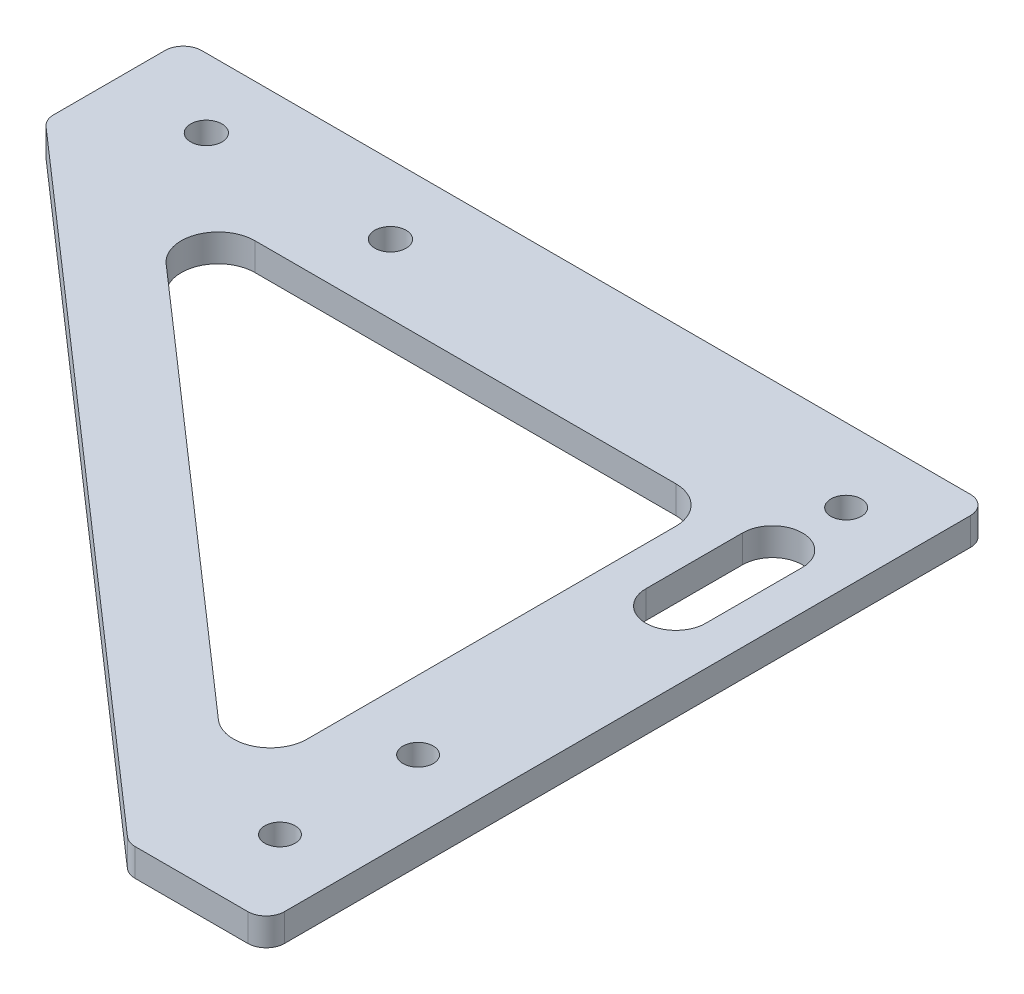
ISO-10303-21;
HEADER;
FILE_DESCRIPTION(('STEP AP214'),'2;1');
FILE_NAME('part.step','',(''),(''),'','','');
FILE_SCHEMA(('AUTOMOTIVE_DESIGN { 1 0 10303 214 1 1 1 1 }'));
ENDSEC;
DATA;
#1=APPLICATION_CONTEXT('core data for automotive mechanical design processes');
#2=APPLICATION_PROTOCOL_DEFINITION('international standard','automotive_design',2000,#1);
#3=PRODUCT_CONTEXT('',#1,'mechanical');
#4=PRODUCT('Part','Part','',(#3));
#5=PRODUCT_RELATED_PRODUCT_CATEGORY('part','',(#4));
#6=PRODUCT_DEFINITION_FORMATION('','',#4);
#7=PRODUCT_DEFINITION_CONTEXT('part definition',#1,'design');
#8=PRODUCT_DEFINITION('design','',#6,#7);
#9=PRODUCT_DEFINITION_SHAPE('','',#8);
#10=(LENGTH_UNIT() NAMED_UNIT(*) SI_UNIT(.MILLI.,.METRE.));
#11=(NAMED_UNIT(*) PLANE_ANGLE_UNIT() SI_UNIT($,.RADIAN.));
#12=(NAMED_UNIT(*) SI_UNIT($,.STERADIAN.) SOLID_ANGLE_UNIT());
#13=UNCERTAINTY_MEASURE_WITH_UNIT(LENGTH_MEASURE(1.E-05),#10,'distance_accuracy_value','');
#14=(GEOMETRIC_REPRESENTATION_CONTEXT(3) GLOBAL_UNCERTAINTY_ASSIGNED_CONTEXT((#13)) GLOBAL_UNIT_ASSIGNED_CONTEXT((#10,
#11,#12)) REPRESENTATION_CONTEXT('',''));
#15=CARTESIAN_POINT('',(0.,0.,0.));
#16=DIRECTION('',(0.,0.,1.));
#17=DIRECTION('',(1.,0.,0.));
#18=AXIS2_PLACEMENT_3D('',#15,#16,#17);
#19=CARTESIAN_POINT('',(0.,3.,0.));
#20=DIRECTION('',(0.,1.,0.));
#21=DIRECTION('',(0.,0.,1.));
#22=AXIS2_PLACEMENT_3D('',#19,#20,#21);
#23=PLANE('',#22);
#24=CARTESIAN_POINT('',(-70.,3.,-19.));
#25=DIRECTION('',(0.,1.,0.));
#26=DIRECTION('',(0.,0.,1.));
#27=AXIS2_PLACEMENT_3D('',#24,#25,#26);
#28=CIRCLE('',#27,1.7);
#29=CARTESIAN_POINT('',(-70.,3.,-17.3));
#30=VERTEX_POINT('',#29);
#31=EDGE_CURVE('E222',#30,#30,#28,.T.);
#32=ORIENTED_EDGE('',*,*,#31,.F.);
#33=EDGE_LOOP('',(#32));
#34=FACE_BOUND('',#33,.T.);
#35=CARTESIAN_POINT('',(0.,3.,28.));
#36=DIRECTION('',(0.,1.,0.));
#37=DIRECTION('',(0.,0.,1.));
#38=AXIS2_PLACEMENT_3D('',#35,#36,#37);
#39=CIRCLE('',#38,1.65);
#40=CARTESIAN_POINT('',(0.,3.,29.65));
#41=VERTEX_POINT('',#40);
#42=EDGE_CURVE('E246',#41,#41,#39,.T.);
#43=ORIENTED_EDGE('',*,*,#42,.F.);
#44=EDGE_LOOP('',(#43));
#45=FACE_BOUND('',#44,.T.);
#46=DIRECTION('',(0.,0.,-1.));
#47=VECTOR('',#46,1.);
#48=CARTESIAN_POINT('',(3.25,3.,0.));
#49=LINE('',#48,#47);
#50=CARTESIAN_POINT('',(3.25,3.,0.));
#51=VERTEX_POINT('',#50);
#52=CARTESIAN_POINT('',(3.25,3.,-10.5));
#53=VERTEX_POINT('',#52);
#54=EDGE_CURVE('E265',#51,#53,#49,.T.);
#55=ORIENTED_EDGE('',*,*,#54,.F.);
#56=CARTESIAN_POINT('',(0.,3.,0.));
#57=DIRECTION('',(0.,1.,0.));
#58=DIRECTION('',(0.,0.,1.));
#59=AXIS2_PLACEMENT_3D('',#56,#57,#58);
#60=CIRCLE('',#59,3.25);
#61=CARTESIAN_POINT('',(-3.25,3.,0.));
#62=VERTEX_POINT('',#61);
#63=EDGE_CURVE('E257',#62,#51,#60,.T.);
#64=ORIENTED_EDGE('',*,*,#63,.F.);
#65=DIRECTION('',(0.,0.,1.));
#66=VECTOR('',#65,1.);
#67=CARTESIAN_POINT('',(-3.25,3.,0.));
#68=LINE('',#67,#66);
#69=CARTESIAN_POINT('',(-3.25,3.,-10.5));
#70=VERTEX_POINT('',#69);
#71=EDGE_CURVE('E268',#70,#62,#68,.T.);
#72=ORIENTED_EDGE('',*,*,#71,.F.);
#73=CARTESIAN_POINT('',(0.,3.,-10.5));
#74=DIRECTION('',(0.,1.,0.));
#75=DIRECTION('',(0.,0.,1.));
#76=AXIS2_PLACEMENT_3D('',#73,#74,#75);
#77=CIRCLE('',#76,3.25);
#78=EDGE_CURVE('E264',#53,#70,#77,.T.);
#79=ORIENTED_EDGE('',*,*,#78,.F.);
#80=EDGE_LOOP('',(#55,#64,#72,#79));
#81=FACE_BOUND('',#80,.T.);
#82=DIRECTION('',(-1.,0.,0.));
#83=VECTOR('',#82,1.);
#84=CARTESIAN_POINT('',(7.50000000000001,3.,-26.5));
#85=LINE('',#84,#83);
#86=CARTESIAN_POINT('',(5.50000000000001,3.,-26.5));
#87=VERTEX_POINT('',#86);
#88=CARTESIAN_POINT('',(-78.,3.,-26.5));
#89=VERTEX_POINT('',#88);
#90=EDGE_CURVE('E294',#87,#89,#85,.T.);
#91=ORIENTED_EDGE('',*,*,#90,.T.);
#92=CARTESIAN_POINT('',(-78.,3.,-24.5));
#93=DIRECTION('',(0.,1.,0.));
#94=DIRECTION('',(0.,0.,1.));
#95=AXIS2_PLACEMENT_3D('',#92,#93,#94);
#96=CIRCLE('',#95,2.);
#97=CARTESIAN_POINT('',(-80.,3.,-24.5));
#98=VERTEX_POINT('',#97);
#99=EDGE_CURVE('E342',#89,#98,#96,.T.);
#100=ORIENTED_EDGE('',*,*,#99,.T.);
#101=DIRECTION('',(0.,0.,1.));
#102=VECTOR('',#101,1.);
#103=CARTESIAN_POINT('',(-80.,3.,-26.5));
#104=LINE('',#103,#102);
#105=CARTESIAN_POINT('',(-80.,3.,-12.4069479846539));
#106=VERTEX_POINT('',#105);
#107=EDGE_CURVE('E297',#98,#106,#104,.T.);
#108=ORIENTED_EDGE('',*,*,#107,.T.);
#109=CARTESIAN_POINT('',(-78.,3.,-12.4069479846539));
#110=DIRECTION('',(0.,1.,0.));
#111=DIRECTION('',(0.,0.,1.));
#112=AXIS2_PLACEMENT_3D('',#109,#110,#111);
#113=CIRCLE('',#112,2.);
#114=CARTESIAN_POINT('',(-79.3177436383001,3.,-10.9024375314766));
#115=VERTEX_POINT('',#114);
#116=EDGE_CURVE('E345',#106,#115,#113,.T.);
#117=ORIENTED_EDGE('',*,*,#116,.T.);
#118=DIRECTION('',(0.752255226588632,0.,0.658871819150043));
#119=VECTOR('',#118,1.);
#120=CARTESIAN_POINT('',(-80.,3.,-11.5));
#121=LINE('',#120,#119);
#122=CARTESIAN_POINT('',(-8.06571641172672,3.,51.5045104531773));
#123=VERTEX_POINT('',#122);
#124=EDGE_CURVE('E303',#115,#123,#121,.T.);
#125=ORIENTED_EDGE('',*,*,#124,.T.);
#126=CARTESIAN_POINT('',(-6.74797277342664,3.,50.));
#127=DIRECTION('',(0.,1.,0.));
#128=DIRECTION('',(0.,0.,1.));
#129=AXIS2_PLACEMENT_3D('',#126,#127,#128);
#130=CIRCLE('',#129,2.);
#131=CARTESIAN_POINT('',(-6.74797277342664,3.,52.));
#132=VERTEX_POINT('',#131);
#133=EDGE_CURVE('E64',#123,#132,#130,.T.);
#134=ORIENTED_EDGE('',*,*,#133,.T.);
#135=DIRECTION('',(1.,0.,0.));
#136=VECTOR('',#135,1.);
#137=CARTESIAN_POINT('',(7.50000000000001,3.,52.));
#138=LINE('',#137,#136);
#139=CARTESIAN_POINT('',(5.50000000000001,3.,52.));
#140=VERTEX_POINT('',#139);
#141=EDGE_CURVE('E301',#132,#140,#138,.T.);
#142=ORIENTED_EDGE('',*,*,#141,.T.);
#143=CARTESIAN_POINT('',(5.50000000000001,3.,50.));
#144=DIRECTION('',(0.,1.,0.));
#145=DIRECTION('',(0.,0.,1.));
#146=AXIS2_PLACEMENT_3D('',#143,#144,#145);
#147=CIRCLE('',#146,2.);
#148=CARTESIAN_POINT('',(7.50000000000001,3.,50.));
#149=VERTEX_POINT('',#148);
#150=EDGE_CURVE('E338',#140,#149,#147,.T.);
#151=ORIENTED_EDGE('',*,*,#150,.T.);
#152=DIRECTION('',(0.,0.,-1.));
#153=VECTOR('',#152,1.);
#154=CARTESIAN_POINT('',(7.50000000000001,3.,52.));
#155=LINE('',#154,#153);
#156=CARTESIAN_POINT('',(7.50000000000001,3.,-24.5));
#157=VERTEX_POINT('',#156);
#158=EDGE_CURVE('E292',#149,#157,#155,.T.);
#159=ORIENTED_EDGE('',*,*,#158,.T.);
#160=CARTESIAN_POINT('',(5.50000000000001,3.,-24.5));
#161=DIRECTION('',(0.,1.,0.));
#162=DIRECTION('',(0.,0.,1.));
#163=AXIS2_PLACEMENT_3D('',#160,#161,#162);
#164=CIRCLE('',#163,2.);
#165=EDGE_CURVE('E340',#157,#87,#164,.T.);
#166=ORIENTED_EDGE('',*,*,#165,.T.);
#167=EDGE_LOOP('',(#91,#100,#108,#117,#125,#134,#142,#151,#159,#166));
#168=FACE_BOUND('',#167,.T.);
#169=CARTESIAN_POINT('',(0.,3.,-18.5));
#170=DIRECTION('',(0.,1.,0.));
#171=DIRECTION('',(0.,0.,1.));
#172=AXIS2_PLACEMENT_3D('',#169,#170,#171);
#173=CIRCLE('',#172,1.65);
#174=CARTESIAN_POINT('',(0.,3.,-16.85));
#175=VERTEX_POINT('',#174);
#176=EDGE_CURVE('E255',#175,#175,#173,.T.);
#177=ORIENTED_EDGE('',*,*,#176,.F.);
#178=EDGE_LOOP('',(#177));
#179=FACE_BOUND('',#178,.T.);
#180=CARTESIAN_POINT('',(0.,3.,43.));
#181=DIRECTION('',(0.,1.,0.));
#182=DIRECTION('',(0.,0.,1.));
#183=AXIS2_PLACEMENT_3D('',#180,#181,#182);
#184=CIRCLE('',#183,1.65);
#185=CARTESIAN_POINT('',(0.,3.,44.65));
#186=VERTEX_POINT('',#185);
#187=EDGE_CURVE('E245',#186,#186,#184,.T.);
#188=ORIENTED_EDGE('',*,*,#187,.F.);
#189=EDGE_LOOP('',(#188));
#190=FACE_BOUND('',#189,.T.);
#191=DIRECTION('',(0.,0.,-1.));
#192=VECTOR('',#191,1.);
#193=CARTESIAN_POINT('',(-7.49999999999999,3.,32.5445189886284));
#194=LINE('',#193,#192);
#195=CARTESIAN_POINT('',(-7.49999999999999,3.,32.5445189886284));
#196=VERTEX_POINT('',#195);
#197=CARTESIAN_POINT('',(-7.49999999999999,3.,-7.5));
#198=VERTEX_POINT('',#197);
#199=EDGE_CURVE('E191',#196,#198,#194,.T.);
#200=ORIENTED_EDGE('',*,*,#199,.F.);
#201=CARTESIAN_POINT('',(-11.5,3.,32.5445189886284));
#202=DIRECTION('',(0.,1.,0.));
#203=DIRECTION('',(0.,0.,1.));
#204=AXIS2_PLACEMENT_3D('',#201,#202,#203);
#205=CIRCLE('',#204,4.);
#206=CARTESIAN_POINT('',(-14.1354872766002,3.,35.5535398949829));
#207=VERTEX_POINT('',#206);
#208=EDGE_CURVE('E181',#207,#196,#205,.T.);
#209=ORIENTED_EDGE('',*,*,#208,.F.);
#210=DIRECTION('',(0.752255226588632,0.,0.658871819150043));
#211=VECTOR('',#210,1.);
#212=CARTESIAN_POINT('',(-59.8556073817271,3.,-4.49097909364547));
#213=LINE('',#212,#211);
#214=CARTESIAN_POINT('',(-59.8556073817271,3.,-4.49097909364547));
#215=VERTEX_POINT('',#214);
#216=EDGE_CURVE('E220',#215,#207,#213,.T.);
#217=ORIENTED_EDGE('',*,*,#216,.F.);
#218=CARTESIAN_POINT('',(-57.2201201051269,3.,-7.49999999999999));
#219=DIRECTION('',(0.,1.,0.));
#220=DIRECTION('',(0.,0.,1.));
#221=AXIS2_PLACEMENT_3D('',#218,#219,#220);
#222=CIRCLE('',#221,4.);
#223=CARTESIAN_POINT('',(-57.2201201051269,3.,-11.5));
#224=VERTEX_POINT('',#223);
#225=EDGE_CURVE('E212',#224,#215,#222,.T.);
#226=ORIENTED_EDGE('',*,*,#225,.F.);
#227=DIRECTION('',(-1.,0.,0.));
#228=VECTOR('',#227,1.);
#229=CARTESIAN_POINT('',(-11.5,3.,-11.5));
#230=LINE('',#229,#228);
#231=CARTESIAN_POINT('',(-11.5,3.,-11.5));
#232=VERTEX_POINT('',#231);
#233=EDGE_CURVE('E207',#232,#224,#230,.T.);
#234=ORIENTED_EDGE('',*,*,#233,.F.);
#235=CARTESIAN_POINT('',(-11.5,3.,-7.5));
#236=DIRECTION('',(0.,1.,0.));
#237=DIRECTION('',(0.,0.,1.));
#238=AXIS2_PLACEMENT_3D('',#235,#236,#237);
#239=CIRCLE('',#238,4.);
#240=EDGE_CURVE('E210',#198,#232,#239,.T.);
#241=ORIENTED_EDGE('',*,*,#240,.F.);
#242=EDGE_LOOP('',(#200,#209,#217,#226,#234,#241));
#243=FACE_BOUND('',#242,.T.);
#244=CARTESIAN_POINT('',(-50.,3.,-19.));
#245=DIRECTION('',(0.,1.,0.));
#246=DIRECTION('',(0.,0.,1.));
#247=AXIS2_PLACEMENT_3D('',#244,#245,#246);
#248=CIRCLE('',#247,1.7);
#249=CARTESIAN_POINT('',(-50.,3.,-17.3));
#250=VERTEX_POINT('',#249);
#251=EDGE_CURVE('E683',#250,#250,#248,.T.);
#252=ORIENTED_EDGE('',*,*,#251,.F.);
#253=EDGE_LOOP('',(#252));
#254=FACE_BOUND('',#253,.T.);
#255=ADVANCED_FACE('F43',(#34,#45,#81,#168,#179,#190,#243,#254),#23,.T.);
#256=CARTESIAN_POINT('',(0.,0.,0.));
#257=DIRECTION('',(0.,1.,0.));
#258=DIRECTION('',(0.,0.,1.));
#259=AXIS2_PLACEMENT_3D('',#256,#257,#258);
#260=PLANE('',#259);
#261=CARTESIAN_POINT('',(0.,0.,43.));
#262=DIRECTION('',(0.,1.,0.));
#263=DIRECTION('',(0.,0.,1.));
#264=AXIS2_PLACEMENT_3D('',#261,#262,#263);
#265=CIRCLE('',#264,1.65);
#266=CARTESIAN_POINT('',(0.,0.,44.65));
#267=VERTEX_POINT('',#266);
#268=EDGE_CURVE('E203',#267,#267,#265,.T.);
#269=ORIENTED_EDGE('',*,*,#268,.T.);
#270=EDGE_LOOP('',(#269));
#271=FACE_BOUND('',#270,.T.);
#272=CARTESIAN_POINT('',(0.,0.,28.));
#273=DIRECTION('',(0.,1.,0.));
#274=DIRECTION('',(0.,0.,1.));
#275=AXIS2_PLACEMENT_3D('',#272,#273,#274);
#276=CIRCLE('',#275,1.65);
#277=CARTESIAN_POINT('',(0.,0.,29.65));
#278=VERTEX_POINT('',#277);
#279=EDGE_CURVE('E244',#278,#278,#276,.T.);
#280=ORIENTED_EDGE('',*,*,#279,.T.);
#281=EDGE_LOOP('',(#280));
#282=FACE_BOUND('',#281,.T.);
#283=CARTESIAN_POINT('',(0.,0.,-18.5));
#284=DIRECTION('',(0.,1.,0.));
#285=DIRECTION('',(0.,0.,1.));
#286=AXIS2_PLACEMENT_3D('',#283,#284,#285);
#287=CIRCLE('',#286,1.65);
#288=CARTESIAN_POINT('',(0.,0.,-16.85));
#289=VERTEX_POINT('',#288);
#290=EDGE_CURVE('E253',#289,#289,#287,.T.);
#291=ORIENTED_EDGE('',*,*,#290,.T.);
#292=EDGE_LOOP('',(#291));
#293=FACE_BOUND('',#292,.T.);
#294=CARTESIAN_POINT('',(0.,0.,0.));
#295=DIRECTION('',(0.,1.,0.));
#296=DIRECTION('',(0.,0.,1.));
#297=AXIS2_PLACEMENT_3D('',#294,#295,#296);
#298=CIRCLE('',#297,3.25);
#299=CARTESIAN_POINT('',(-3.25,0.,0.));
#300=VERTEX_POINT('',#299);
#301=CARTESIAN_POINT('',(3.25,0.,0.));
#302=VERTEX_POINT('',#301);
#303=EDGE_CURVE('E260',#300,#302,#298,.T.);
#304=ORIENTED_EDGE('',*,*,#303,.T.);
#305=DIRECTION('',(0.,0.,-1.));
#306=VECTOR('',#305,1.);
#307=CARTESIAN_POINT('',(3.25,0.,0.));
#308=LINE('',#307,#306);
#309=CARTESIAN_POINT('',(3.25,0.,-10.5));
#310=VERTEX_POINT('',#309);
#311=EDGE_CURVE('E272',#302,#310,#308,.T.);
#312=ORIENTED_EDGE('',*,*,#311,.T.);
#313=CARTESIAN_POINT('',(0.,0.,-10.5));
#314=DIRECTION('',(0.,1.,0.));
#315=DIRECTION('',(0.,0.,1.));
#316=AXIS2_PLACEMENT_3D('',#313,#314,#315);
#317=CIRCLE('',#316,3.25);
#318=CARTESIAN_POINT('',(-3.25,0.,-10.5));
#319=VERTEX_POINT('',#318);
#320=EDGE_CURVE('E277',#310,#319,#317,.T.);
#321=ORIENTED_EDGE('',*,*,#320,.T.);
#322=DIRECTION('',(0.,0.,1.));
#323=VECTOR('',#322,1.);
#324=CARTESIAN_POINT('',(-3.25,0.,0.));
#325=LINE('',#324,#323);
#326=EDGE_CURVE('E263',#319,#300,#325,.T.);
#327=ORIENTED_EDGE('',*,*,#326,.T.);
#328=EDGE_LOOP('',(#304,#312,#321,#327));
#329=FACE_BOUND('',#328,.T.);
#330=DIRECTION('',(0.,0.,1.));
#331=VECTOR('',#330,1.);
#332=CARTESIAN_POINT('',(-80.,0.,-26.5));
#333=LINE('',#332,#331);
#334=CARTESIAN_POINT('',(-80.,0.,-24.5));
#335=VERTEX_POINT('',#334);
#336=CARTESIAN_POINT('',(-80.,0.,-12.4069479846539));
#337=VERTEX_POINT('',#336);
#338=EDGE_CURVE('E313',#335,#337,#333,.T.);
#339=ORIENTED_EDGE('',*,*,#338,.F.);
#340=CARTESIAN_POINT('',(-78.,0.,-24.5));
#341=DIRECTION('',(0.,1.,0.));
#342=DIRECTION('',(0.,0.,1.));
#343=AXIS2_PLACEMENT_3D('',#340,#341,#342);
#344=CIRCLE('',#343,2.);
#345=CARTESIAN_POINT('',(-78.,0.,-26.5));
#346=VERTEX_POINT('',#345);
#347=EDGE_CURVE('E329',#335,#346,#344,.F.);
#348=ORIENTED_EDGE('',*,*,#347,.T.);
#349=DIRECTION('',(-1.,0.,0.));
#350=VECTOR('',#349,1.);
#351=CARTESIAN_POINT('',(-7.49999999999999,0.,-26.5));
#352=LINE('',#351,#350);
#353=CARTESIAN_POINT('',(5.50000000000001,0.,-26.5));
#354=VERTEX_POINT('',#353);
#355=EDGE_CURVE('E306',#354,#346,#352,.T.);
#356=ORIENTED_EDGE('',*,*,#355,.F.);
#357=CARTESIAN_POINT('',(5.50000000000001,0.,-24.5));
#358=DIRECTION('',(0.,1.,0.));
#359=DIRECTION('',(0.,0.,1.));
#360=AXIS2_PLACEMENT_3D('',#357,#358,#359);
#361=CIRCLE('',#360,2.);
#362=CARTESIAN_POINT('',(7.50000000000001,0.,-24.5));
#363=VERTEX_POINT('',#362);
#364=EDGE_CURVE('E325',#354,#363,#361,.F.);
#365=ORIENTED_EDGE('',*,*,#364,.T.);
#366=DIRECTION('',(0.,0.,-1.));
#367=VECTOR('',#366,1.);
#368=CARTESIAN_POINT('',(7.50000000000001,0.,52.));
#369=LINE('',#368,#367);
#370=CARTESIAN_POINT('',(7.50000000000001,0.,50.));
#371=VERTEX_POINT('',#370);
#372=EDGE_CURVE('E289',#371,#363,#369,.T.);
#373=ORIENTED_EDGE('',*,*,#372,.F.);
#374=CARTESIAN_POINT('',(5.50000000000001,0.,50.));
#375=DIRECTION('',(0.,1.,0.));
#376=DIRECTION('',(0.,0.,1.));
#377=AXIS2_PLACEMENT_3D('',#374,#375,#376);
#378=CIRCLE('',#377,2.);
#379=CARTESIAN_POINT('',(5.50000000000001,0.,52.));
#380=VERTEX_POINT('',#379);
#381=EDGE_CURVE('E322',#371,#380,#378,.F.);
#382=ORIENTED_EDGE('',*,*,#381,.T.);
#383=DIRECTION('',(1.,0.,0.));
#384=VECTOR('',#383,1.);
#385=CARTESIAN_POINT('',(7.50000000000001,0.,52.));
#386=LINE('',#385,#384);
#387=CARTESIAN_POINT('',(-6.74797277342664,0.,52.));
#388=VERTEX_POINT('',#387);
#389=EDGE_CURVE('E293',#388,#380,#386,.T.);
#390=ORIENTED_EDGE('',*,*,#389,.F.);
#391=CARTESIAN_POINT('',(-6.74797277342664,0.,50.));
#392=DIRECTION('',(0.,1.,0.));
#393=DIRECTION('',(0.,0.,1.));
#394=AXIS2_PLACEMENT_3D('',#391,#392,#393);
#395=CIRCLE('',#394,2.);
#396=CARTESIAN_POINT('',(-8.06571641172672,0.,51.5045104531773));
#397=VERTEX_POINT('',#396);
#398=EDGE_CURVE('E326',#388,#397,#395,.F.);
#399=ORIENTED_EDGE('',*,*,#398,.T.);
#400=DIRECTION('',(0.752255226588632,0.,0.658871819150043));
#401=VECTOR('',#400,1.);
#402=CARTESIAN_POINT('',(-80.,0.,-11.5));
#403=LINE('',#402,#401);
#404=CARTESIAN_POINT('',(-79.3177436383001,0.,-10.9024375314766));
#405=VERTEX_POINT('',#404);
#406=EDGE_CURVE('E314',#405,#397,#403,.T.);
#407=ORIENTED_EDGE('',*,*,#406,.F.);
#408=CARTESIAN_POINT('',(-78.,0.,-12.4069479846539));
#409=DIRECTION('',(0.,1.,0.));
#410=DIRECTION('',(0.,0.,1.));
#411=AXIS2_PLACEMENT_3D('',#408,#409,#410);
#412=CIRCLE('',#411,2.);
#413=EDGE_CURVE('E327',#405,#337,#412,.F.);
#414=ORIENTED_EDGE('',*,*,#413,.T.);
#415=EDGE_LOOP('',(#339,#348,#356,#365,#373,#382,#390,#399,#407,#414));
#416=FACE_BOUND('',#415,.T.);
#417=CARTESIAN_POINT('',(-11.5,0.,32.5445189886284));
#418=DIRECTION('',(0.,1.,0.));
#419=DIRECTION('',(0.,0.,1.));
#420=AXIS2_PLACEMENT_3D('',#417,#418,#419);
#421=CIRCLE('',#420,4.);
#422=CARTESIAN_POINT('',(-14.1354872766002,0.,35.5535398949829));
#423=VERTEX_POINT('',#422);
#424=CARTESIAN_POINT('',(-7.49999999999999,0.,32.5445189886284));
#425=VERTEX_POINT('',#424);
#426=EDGE_CURVE('E218',#423,#425,#421,.T.);
#427=ORIENTED_EDGE('',*,*,#426,.T.);
#428=DIRECTION('',(0.,0.,-1.));
#429=VECTOR('',#428,1.);
#430=CARTESIAN_POINT('',(-7.49999999999999,0.,32.5445189886284));
#431=LINE('',#430,#429);
#432=CARTESIAN_POINT('',(-7.49999999999999,0.,-7.5));
#433=VERTEX_POINT('',#432);
#434=EDGE_CURVE('E199',#425,#433,#431,.T.);
#435=ORIENTED_EDGE('',*,*,#434,.T.);
#436=CARTESIAN_POINT('',(-11.5,0.,-7.5));
#437=DIRECTION('',(0.,1.,0.));
#438=DIRECTION('',(0.,0.,1.));
#439=AXIS2_PLACEMENT_3D('',#436,#437,#438);
#440=CIRCLE('',#439,4.);
#441=CARTESIAN_POINT('',(-11.5,0.,-11.5));
#442=VERTEX_POINT('',#441);
#443=EDGE_CURVE('E224',#433,#442,#440,.T.);
#444=ORIENTED_EDGE('',*,*,#443,.T.);
#445=DIRECTION('',(-1.,0.,0.));
#446=VECTOR('',#445,1.);
#447=CARTESIAN_POINT('',(-11.5,0.,-11.5));
#448=LINE('',#447,#446);
#449=CARTESIAN_POINT('',(-57.2201201051269,0.,-11.5));
#450=VERTEX_POINT('',#449);
#451=EDGE_CURVE('E226',#442,#450,#448,.T.);
#452=ORIENTED_EDGE('',*,*,#451,.T.);
#453=CARTESIAN_POINT('',(-57.2201201051269,0.,-7.49999999999999));
#454=DIRECTION('',(0.,1.,0.));
#455=DIRECTION('',(0.,0.,1.));
#456=AXIS2_PLACEMENT_3D('',#453,#454,#455);
#457=CIRCLE('',#456,4.);
#458=CARTESIAN_POINT('',(-59.8556073817271,0.,-4.49097909364547));
#459=VERTEX_POINT('',#458);
#460=EDGE_CURVE('E228',#450,#459,#457,.T.);
#461=ORIENTED_EDGE('',*,*,#460,.T.);
#462=DIRECTION('',(0.752255226588632,0.,0.658871819150043));
#463=VECTOR('',#462,1.);
#464=CARTESIAN_POINT('',(-59.8556073817271,0.,-4.49097909364547));
#465=LINE('',#464,#463);
#466=EDGE_CURVE('E192',#459,#423,#465,.T.);
#467=ORIENTED_EDGE('',*,*,#466,.T.);
#468=EDGE_LOOP('',(#427,#435,#444,#452,#461,#467));
#469=FACE_BOUND('',#468,.T.);
#470=CARTESIAN_POINT('',(-70.,0.,-19.));
#471=DIRECTION('',(0.,1.,0.));
#472=DIRECTION('',(0.,0.,1.));
#473=AXIS2_PLACEMENT_3D('',#470,#471,#472);
#474=CIRCLE('',#473,1.7);
#475=CARTESIAN_POINT('',(-70.,0.,-17.3));
#476=VERTEX_POINT('',#475);
#477=EDGE_CURVE('E679',#476,#476,#474,.T.);
#478=ORIENTED_EDGE('',*,*,#477,.T.);
#479=EDGE_LOOP('',(#478));
#480=FACE_BOUND('',#479,.T.);
#481=CARTESIAN_POINT('',(-50.,0.,-19.));
#482=DIRECTION('',(0.,1.,0.));
#483=DIRECTION('',(0.,0.,1.));
#484=AXIS2_PLACEMENT_3D('',#481,#482,#483);
#485=CIRCLE('',#484,1.7);
#486=CARTESIAN_POINT('',(-50.,0.,-17.3));
#487=VERTEX_POINT('',#486);
#488=EDGE_CURVE('E685',#487,#487,#485,.T.);
#489=ORIENTED_EDGE('',*,*,#488,.T.);
#490=EDGE_LOOP('',(#489));
#491=FACE_BOUND('',#490,.T.);
#492=ADVANCED_FACE('F375',(#271,#282,#293,#329,#416,#469,#480,#491),#260,.F.);
#493=CARTESIAN_POINT('',(7.50000000000001,3.,52.));
#494=DIRECTION('',(-1.,0.,0.));
#495=DIRECTION('',(0.,0.,1.));
#496=AXIS2_PLACEMENT_3D('',#493,#494,#495);
#497=PLANE('',#496);
#498=ORIENTED_EDGE('',*,*,#158,.F.);
#499=DIRECTION('',(0.,-1.,0.));
#500=VECTOR('',#499,1.);
#501=CARTESIAN_POINT('',(7.50000000000001,3.,50.));
#502=LINE('',#501,#500);
#503=EDGE_CURVE('E11',#149,#371,#502,.T.);
#504=ORIENTED_EDGE('',*,*,#503,.T.);
#505=ORIENTED_EDGE('',*,*,#372,.T.);
#506=DIRECTION('',(0.,-1.,0.));
#507=VECTOR('',#506,1.);
#508=CARTESIAN_POINT('',(7.50000000000001,3.,-24.5));
#509=LINE('',#508,#507);
#510=EDGE_CURVE('E51',#363,#157,#509,.F.);
#511=ORIENTED_EDGE('',*,*,#510,.T.);
#512=EDGE_LOOP('',(#498,#504,#505,#511));
#513=FACE_BOUND('',#512,.T.);
#514=ADVANCED_FACE('F360',(#513),#497,.F.);
#515=CARTESIAN_POINT('',(-7.49999999999999,3.,-26.5));
#516=DIRECTION('',(0.,0.,1.));
#517=DIRECTION('',(1.,0.,0.));
#518=AXIS2_PLACEMENT_3D('',#515,#516,#517);
#519=PLANE('',#518);
#520=ORIENTED_EDGE('',*,*,#355,.T.);
#521=DIRECTION('',(0.,-1.,0.));
#522=VECTOR('',#521,1.);
#523=CARTESIAN_POINT('',(-78.,3.,-26.5));
#524=LINE('',#523,#522);
#525=EDGE_CURVE('E333',#346,#89,#524,.F.);
#526=ORIENTED_EDGE('',*,*,#525,.T.);
#527=ORIENTED_EDGE('',*,*,#90,.F.);
#528=DIRECTION('',(0.,-1.,0.));
#529=VECTOR('',#528,1.);
#530=CARTESIAN_POINT('',(5.50000000000001,3.,-26.5));
#531=LINE('',#530,#529);
#532=EDGE_CURVE('E335',#87,#354,#531,.T.);
#533=ORIENTED_EDGE('',*,*,#532,.T.);
#534=EDGE_LOOP('',(#520,#526,#527,#533));
#535=FACE_BOUND('',#534,.T.);
#536=ADVANCED_FACE('F366',(#535),#519,.F.);
#537=CARTESIAN_POINT('',(-80.,3.,-26.5));
#538=DIRECTION('',(1.,0.,0.));
#539=DIRECTION('',(0.,0.,-1.));
#540=AXIS2_PLACEMENT_3D('',#537,#538,#539);
#541=PLANE('',#540);
#542=ORIENTED_EDGE('',*,*,#107,.F.);
#543=DIRECTION('',(0.,-1.,0.));
#544=VECTOR('',#543,1.);
#545=CARTESIAN_POINT('',(-80.,3.,-24.5));
#546=LINE('',#545,#544);
#547=EDGE_CURVE('E317',#98,#335,#546,.T.);
#548=ORIENTED_EDGE('',*,*,#547,.T.);
#549=ORIENTED_EDGE('',*,*,#338,.T.);
#550=DIRECTION('',(0.,-1.,0.));
#551=VECTOR('',#550,1.);
#552=CARTESIAN_POINT('',(-80.,3.,-12.4069479846539));
#553=LINE('',#552,#551);
#554=EDGE_CURVE('E304',#337,#106,#553,.F.);
#555=ORIENTED_EDGE('',*,*,#554,.T.);
#556=EDGE_LOOP('',(#542,#548,#549,#555));
#557=FACE_BOUND('',#556,.T.);
#558=ADVANCED_FACE('F379',(#557),#541,.F.);
#559=CARTESIAN_POINT('',(-80.,3.,-11.5));
#560=DIRECTION('',(0.658871819150043,0.,-0.752255226588632));
#561=DIRECTION('',(-0.752255226588632,0.,-0.658871819150043));
#562=AXIS2_PLACEMENT_3D('',#559,#560,#561);
#563=PLANE('',#562);
#564=ORIENTED_EDGE('',*,*,#124,.F.);
#565=DIRECTION('',(0.,-1.,0.));
#566=VECTOR('',#565,1.);
#567=CARTESIAN_POINT('',(-79.3177436383001,3.,-10.9024375314766));
#568=LINE('',#567,#566);
#569=EDGE_CURVE('E346',#115,#405,#568,.T.);
#570=ORIENTED_EDGE('',*,*,#569,.T.);
#571=ORIENTED_EDGE('',*,*,#406,.T.);
#572=DIRECTION('',(0.,-1.,0.));
#573=VECTOR('',#572,1.);
#574=CARTESIAN_POINT('',(-8.06571641172674,3.,51.5045104531773));
#575=LINE('',#574,#573);
#576=EDGE_CURVE('E347',#397,#123,#575,.F.);
#577=ORIENTED_EDGE('',*,*,#576,.T.);
#578=EDGE_LOOP('',(#564,#570,#571,#577));
#579=FACE_BOUND('',#578,.T.);
#580=ADVANCED_FACE('F386',(#579),#563,.F.);
#581=CARTESIAN_POINT('',(7.50000000000001,3.,52.));
#582=DIRECTION('',(0.,0.,-1.));
#583=DIRECTION('',(-1.,0.,0.));
#584=AXIS2_PLACEMENT_3D('',#581,#582,#583);
#585=PLANE('',#584);
#586=ORIENTED_EDGE('',*,*,#141,.F.);
#587=DIRECTION('',(0.,-1.,0.));
#588=VECTOR('',#587,1.);
#589=CARTESIAN_POINT('',(-6.74797277342664,3.,52.));
#590=LINE('',#589,#588);
#591=EDGE_CURVE('E355',#132,#388,#590,.T.);
#592=ORIENTED_EDGE('',*,*,#591,.T.);
#593=ORIENTED_EDGE('',*,*,#389,.T.);
#594=DIRECTION('',(0.,-1.,0.));
#595=VECTOR('',#594,1.);
#596=CARTESIAN_POINT('',(5.50000000000001,3.,52.));
#597=LINE('',#596,#595);
#598=EDGE_CURVE('E59',#380,#140,#597,.F.);
#599=ORIENTED_EDGE('',*,*,#598,.T.);
#600=EDGE_LOOP('',(#586,#592,#593,#599));
#601=FACE_BOUND('',#600,.T.);
#602=ADVANCED_FACE('F394',(#601),#585,.F.);
#603=CARTESIAN_POINT('',(0.,3.,0.));
#604=DIRECTION('',(0.,-1.,0.));
#605=DIRECTION('',(0.,0.,-1.));
#606=AXIS2_PLACEMENT_3D('',#603,#604,#605);
#607=CYLINDRICAL_SURFACE('',#606,3.25);
#608=ORIENTED_EDGE('',*,*,#303,.F.);
#609=DIRECTION('',(0.,-1.,0.));
#610=VECTOR('',#609,1.);
#611=CARTESIAN_POINT('',(-3.25,3.,0.));
#612=LINE('',#611,#610);
#613=EDGE_CURVE('E269',#62,#300,#612,.T.);
#614=ORIENTED_EDGE('',*,*,#613,.F.);
#615=ORIENTED_EDGE('',*,*,#63,.T.);
#616=DIRECTION('',(0.,-1.,0.));
#617=VECTOR('',#616,1.);
#618=CARTESIAN_POINT('',(3.25,3.,0.));
#619=LINE('',#618,#617);
#620=EDGE_CURVE('E290',#51,#302,#619,.T.);
#621=ORIENTED_EDGE('',*,*,#620,.T.);
#622=EDGE_LOOP('',(#608,#614,#615,#621));
#623=FACE_BOUND('',#622,.T.);
#624=ADVANCED_FACE('F418',(#623),#607,.F.);
#625=CARTESIAN_POINT('',(3.25,3.,0.));
#626=DIRECTION('',(-1.,0.,0.));
#627=DIRECTION('',(0.,0.,1.));
#628=AXIS2_PLACEMENT_3D('',#625,#626,#627);
#629=PLANE('',#628);
#630=ORIENTED_EDGE('',*,*,#311,.F.);
#631=ORIENTED_EDGE('',*,*,#620,.F.);
#632=ORIENTED_EDGE('',*,*,#54,.T.);
#633=DIRECTION('',(0.,-1.,0.));
#634=VECTOR('',#633,1.);
#635=CARTESIAN_POINT('',(3.25,3.,-10.5));
#636=LINE('',#635,#634);
#637=EDGE_CURVE('E284',#53,#310,#636,.T.);
#638=ORIENTED_EDGE('',*,*,#637,.T.);
#639=EDGE_LOOP('',(#630,#631,#632,#638));
#640=FACE_BOUND('',#639,.T.);
#641=ADVANCED_FACE('F569',(#640),#629,.T.);
#642=CARTESIAN_POINT('',(0.,3.,-10.5));
#643=DIRECTION('',(0.,-1.,0.));
#644=DIRECTION('',(0.,0.,-1.));
#645=AXIS2_PLACEMENT_3D('',#642,#643,#644);
#646=CYLINDRICAL_SURFACE('',#645,3.25);
#647=ORIENTED_EDGE('',*,*,#320,.F.);
#648=ORIENTED_EDGE('',*,*,#637,.F.);
#649=ORIENTED_EDGE('',*,*,#78,.T.);
#650=DIRECTION('',(0.,-1.,0.));
#651=VECTOR('',#650,1.);
#652=CARTESIAN_POINT('',(-3.25,3.,-10.5));
#653=LINE('',#652,#651);
#654=EDGE_CURVE('E282',#70,#319,#653,.T.);
#655=ORIENTED_EDGE('',*,*,#654,.T.);
#656=EDGE_LOOP('',(#647,#648,#649,#655));
#657=FACE_BOUND('',#656,.T.);
#658=ADVANCED_FACE('F559',(#657),#646,.F.);
#659=CARTESIAN_POINT('',(-3.25,3.,0.));
#660=DIRECTION('',(1.,0.,0.));
#661=DIRECTION('',(0.,0.,-1.));
#662=AXIS2_PLACEMENT_3D('',#659,#660,#661);
#663=PLANE('',#662);
#664=ORIENTED_EDGE('',*,*,#326,.F.);
#665=ORIENTED_EDGE('',*,*,#654,.F.);
#666=ORIENTED_EDGE('',*,*,#71,.T.);
#667=ORIENTED_EDGE('',*,*,#613,.T.);
#668=EDGE_LOOP('',(#664,#665,#666,#667));
#669=FACE_BOUND('',#668,.T.);
#670=ADVANCED_FACE('F552',(#669),#663,.T.);
#671=CARTESIAN_POINT('',(0.,3.,-18.5));
#672=DIRECTION('',(0.,-1.,0.));
#673=DIRECTION('',(0.,0.,-1.));
#674=AXIS2_PLACEMENT_3D('',#671,#672,#673);
#675=CYLINDRICAL_SURFACE('',#674,1.65);
#676=ORIENTED_EDGE('',*,*,#176,.T.);
#677=EDGE_LOOP('',(#676));
#678=FACE_BOUND('',#677,.T.);
#679=ORIENTED_EDGE('',*,*,#290,.F.);
#680=EDGE_LOOP('',(#679));
#681=FACE_BOUND('',#680,.T.);
#682=ADVANCED_FACE('F545',(#678,#681),#675,.F.);
#683=CARTESIAN_POINT('',(0.,3.,28.));
#684=DIRECTION('',(0.,-1.,0.));
#685=DIRECTION('',(0.,0.,-1.));
#686=AXIS2_PLACEMENT_3D('',#683,#684,#685);
#687=CYLINDRICAL_SURFACE('',#686,1.65);
#688=ORIENTED_EDGE('',*,*,#42,.T.);
#689=EDGE_LOOP('',(#688));
#690=FACE_BOUND('',#689,.T.);
#691=ORIENTED_EDGE('',*,*,#279,.F.);
#692=EDGE_LOOP('',(#691));
#693=FACE_BOUND('',#692,.T.);
#694=ADVANCED_FACE('F531',(#690,#693),#687,.F.);
#695=CARTESIAN_POINT('',(0.,3.,43.));
#696=DIRECTION('',(0.,-1.,0.));
#697=DIRECTION('',(0.,0.,-1.));
#698=AXIS2_PLACEMENT_3D('',#695,#696,#697);
#699=CYLINDRICAL_SURFACE('',#698,1.65);
#700=ORIENTED_EDGE('',*,*,#187,.T.);
#701=EDGE_LOOP('',(#700));
#702=FACE_BOUND('',#701,.T.);
#703=ORIENTED_EDGE('',*,*,#268,.F.);
#704=EDGE_LOOP('',(#703));
#705=FACE_BOUND('',#704,.T.);
#706=ADVANCED_FACE('F524',(#702,#705),#699,.F.);
#707=CARTESIAN_POINT('',(-11.5,3.,32.5445189886284));
#708=DIRECTION('',(0.,-1.,0.));
#709=DIRECTION('',(0.,0.,-1.));
#710=AXIS2_PLACEMENT_3D('',#707,#708,#709);
#711=CYLINDRICAL_SURFACE('',#710,4.);
#712=ORIENTED_EDGE('',*,*,#426,.F.);
#713=DIRECTION('',(0.,-1.,0.));
#714=VECTOR('',#713,1.);
#715=CARTESIAN_POINT('',(-14.1354872766002,3.,35.5535398949829));
#716=LINE('',#715,#714);
#717=EDGE_CURVE('E188',#207,#423,#716,.T.);
#718=ORIENTED_EDGE('',*,*,#717,.F.);
#719=ORIENTED_EDGE('',*,*,#208,.T.);
#720=DIRECTION('',(0.,-1.,0.));
#721=VECTOR('',#720,1.);
#722=CARTESIAN_POINT('',(-7.49999999999999,3.,32.5445189886284));
#723=LINE('',#722,#721);
#724=EDGE_CURVE('E186',#196,#425,#723,.T.);
#725=ORIENTED_EDGE('',*,*,#724,.T.);
#726=EDGE_LOOP('',(#712,#718,#719,#725));
#727=FACE_BOUND('',#726,.T.);
#728=ADVANCED_FACE('F183',(#727),#711,.F.);
#729=CARTESIAN_POINT('',(-7.49999999999999,3.,32.5445189886284));
#730=DIRECTION('',(-1.,0.,0.));
#731=DIRECTION('',(0.,0.,1.));
#732=AXIS2_PLACEMENT_3D('',#729,#730,#731);
#733=PLANE('',#732);
#734=ORIENTED_EDGE('',*,*,#434,.F.);
#735=ORIENTED_EDGE('',*,*,#724,.F.);
#736=ORIENTED_EDGE('',*,*,#199,.T.);
#737=DIRECTION('',(0.,-1.,0.));
#738=VECTOR('',#737,1.);
#739=CARTESIAN_POINT('',(-7.49999999999999,3.,-7.5));
#740=LINE('',#739,#738);
#741=EDGE_CURVE('E205',#198,#433,#740,.T.);
#742=ORIENTED_EDGE('',*,*,#741,.T.);
#743=EDGE_LOOP('',(#734,#735,#736,#742));
#744=FACE_BOUND('',#743,.T.);
#745=ADVANCED_FACE('F197',(#744),#733,.T.);
#746=CARTESIAN_POINT('',(-11.5,3.,-7.5));
#747=DIRECTION('',(0.,-1.,0.));
#748=DIRECTION('',(0.,0.,-1.));
#749=AXIS2_PLACEMENT_3D('',#746,#747,#748);
#750=CYLINDRICAL_SURFACE('',#749,4.);
#751=ORIENTED_EDGE('',*,*,#443,.F.);
#752=ORIENTED_EDGE('',*,*,#741,.F.);
#753=ORIENTED_EDGE('',*,*,#240,.T.);
#754=DIRECTION('',(0.,-1.,0.));
#755=VECTOR('',#754,1.);
#756=CARTESIAN_POINT('',(-11.5,3.,-11.5));
#757=LINE('',#756,#755);
#758=EDGE_CURVE('E239',#232,#442,#757,.T.);
#759=ORIENTED_EDGE('',*,*,#758,.T.);
#760=EDGE_LOOP('',(#751,#752,#753,#759));
#761=FACE_BOUND('',#760,.T.);
#762=ADVANCED_FACE('F501',(#761),#750,.F.);
#763=CARTESIAN_POINT('',(-11.5,3.,-11.5));
#764=DIRECTION('',(0.,0.,1.));
#765=DIRECTION('',(1.,0.,0.));
#766=AXIS2_PLACEMENT_3D('',#763,#764,#765);
#767=PLANE('',#766);
#768=ORIENTED_EDGE('',*,*,#451,.F.);
#769=ORIENTED_EDGE('',*,*,#758,.F.);
#770=ORIENTED_EDGE('',*,*,#233,.T.);
#771=DIRECTION('',(0.,-1.,0.));
#772=VECTOR('',#771,1.);
#773=CARTESIAN_POINT('',(-57.2201201051269,3.,-11.5));
#774=LINE('',#773,#772);
#775=EDGE_CURVE('E240',#224,#450,#774,.T.);
#776=ORIENTED_EDGE('',*,*,#775,.T.);
#777=EDGE_LOOP('',(#768,#769,#770,#776));
#778=FACE_BOUND('',#777,.T.);
#779=ADVANCED_FACE('F495',(#778),#767,.T.);
#780=CARTESIAN_POINT('',(-57.2201201051269,3.,-7.49999999999999));
#781=DIRECTION('',(0.,-1.,0.));
#782=DIRECTION('',(0.,0.,-1.));
#783=AXIS2_PLACEMENT_3D('',#780,#781,#782);
#784=CYLINDRICAL_SURFACE('',#783,4.);
#785=ORIENTED_EDGE('',*,*,#460,.F.);
#786=ORIENTED_EDGE('',*,*,#775,.F.);
#787=ORIENTED_EDGE('',*,*,#225,.T.);
#788=DIRECTION('',(0.,-1.,0.));
#789=VECTOR('',#788,1.);
#790=CARTESIAN_POINT('',(-59.8556073817271,3.,-4.49097909364547));
#791=LINE('',#790,#789);
#792=EDGE_CURVE('E234',#215,#459,#791,.T.);
#793=ORIENTED_EDGE('',*,*,#792,.T.);
#794=EDGE_LOOP('',(#785,#786,#787,#793));
#795=FACE_BOUND('',#794,.T.);
#796=ADVANCED_FACE('F483',(#795),#784,.F.);
#797=CARTESIAN_POINT('',(-59.8556073817271,3.,-4.49097909364547));
#798=DIRECTION('',(0.658871819150043,0.,-0.752255226588632));
#799=DIRECTION('',(-0.752255226588632,0.,-0.658871819150043));
#800=AXIS2_PLACEMENT_3D('',#797,#798,#799);
#801=PLANE('',#800);
#802=ORIENTED_EDGE('',*,*,#466,.F.);
#803=ORIENTED_EDGE('',*,*,#792,.F.);
#804=ORIENTED_EDGE('',*,*,#216,.T.);
#805=ORIENTED_EDGE('',*,*,#717,.T.);
#806=EDGE_LOOP('',(#802,#803,#804,#805));
#807=FACE_BOUND('',#806,.T.);
#808=ADVANCED_FACE('F475',(#807),#801,.T.);
#809=CARTESIAN_POINT('',(-70.,3.,-19.));
#810=DIRECTION('',(0.,-1.,0.));
#811=DIRECTION('',(0.,0.,-1.));
#812=AXIS2_PLACEMENT_3D('',#809,#810,#811);
#813=CYLINDRICAL_SURFACE('',#812,1.7);
#814=ORIENTED_EDGE('',*,*,#31,.T.);
#815=EDGE_LOOP('',(#814));
#816=FACE_BOUND('',#815,.T.);
#817=ORIENTED_EDGE('',*,*,#477,.F.);
#818=EDGE_LOOP('',(#817));
#819=FACE_BOUND('',#818,.T.);
#820=ADVANCED_FACE('F464',(#816,#819),#813,.F.);
#821=CARTESIAN_POINT('',(-50.,3.,-19.));
#822=DIRECTION('',(0.,-1.,0.));
#823=DIRECTION('',(0.,0.,-1.));
#824=AXIS2_PLACEMENT_3D('',#821,#822,#823);
#825=CYLINDRICAL_SURFACE('',#824,1.7);
#826=ORIENTED_EDGE('',*,*,#251,.T.);
#827=EDGE_LOOP('',(#826));
#828=FACE_BOUND('',#827,.T.);
#829=ORIENTED_EDGE('',*,*,#488,.F.);
#830=EDGE_LOOP('',(#829));
#831=FACE_BOUND('',#830,.T.);
#832=ADVANCED_FACE('F431',(#828,#831),#825,.F.);
#833=CARTESIAN_POINT('',(-78.,3.,-24.5));
#834=DIRECTION('',(0.,-1.,0.));
#835=DIRECTION('',(0.,0.,-1.));
#836=AXIS2_PLACEMENT_3D('',#833,#834,#835);
#837=CYLINDRICAL_SURFACE('',#836,2.);
#838=ORIENTED_EDGE('',*,*,#99,.F.);
#839=ORIENTED_EDGE('',*,*,#525,.F.);
#840=ORIENTED_EDGE('',*,*,#347,.F.);
#841=ORIENTED_EDGE('',*,*,#547,.F.);
#842=EDGE_LOOP('',(#838,#839,#840,#841));
#843=FACE_BOUND('',#842,.T.);
#844=ADVANCED_FACE('F380',(#843),#837,.T.);
#845=CARTESIAN_POINT('',(-78.,3.,-12.4069479846539));
#846=DIRECTION('',(0.,-1.,0.));
#847=DIRECTION('',(0.,0.,-1.));
#848=AXIS2_PLACEMENT_3D('',#845,#846,#847);
#849=CYLINDRICAL_SURFACE('',#848,2.);
#850=ORIENTED_EDGE('',*,*,#116,.F.);
#851=ORIENTED_EDGE('',*,*,#554,.F.);
#852=ORIENTED_EDGE('',*,*,#413,.F.);
#853=ORIENTED_EDGE('',*,*,#569,.F.);
#854=EDGE_LOOP('',(#850,#851,#852,#853));
#855=FACE_BOUND('',#854,.T.);
#856=ADVANCED_FACE('F387',(#855),#849,.T.);
#857=CARTESIAN_POINT('',(-6.74797277342664,3.,50.));
#858=DIRECTION('',(0.,-1.,0.));
#859=DIRECTION('',(0.,0.,-1.));
#860=AXIS2_PLACEMENT_3D('',#857,#858,#859);
#861=CYLINDRICAL_SURFACE('',#860,2.);
#862=ORIENTED_EDGE('',*,*,#133,.F.);
#863=ORIENTED_EDGE('',*,*,#576,.F.);
#864=ORIENTED_EDGE('',*,*,#398,.F.);
#865=ORIENTED_EDGE('',*,*,#591,.F.);
#866=EDGE_LOOP('',(#862,#863,#864,#865));
#867=FACE_BOUND('',#866,.T.);
#868=ADVANCED_FACE('F393',(#867),#861,.T.);
#869=CARTESIAN_POINT('',(5.50000000000001,3.,50.));
#870=DIRECTION('',(0.,-1.,0.));
#871=DIRECTION('',(0.,0.,-1.));
#872=AXIS2_PLACEMENT_3D('',#869,#870,#871);
#873=CYLINDRICAL_SURFACE('',#872,2.);
#874=ORIENTED_EDGE('',*,*,#150,.F.);
#875=ORIENTED_EDGE('',*,*,#598,.F.);
#876=ORIENTED_EDGE('',*,*,#381,.F.);
#877=ORIENTED_EDGE('',*,*,#503,.F.);
#878=EDGE_LOOP('',(#874,#875,#876,#877));
#879=FACE_BOUND('',#878,.T.);
#880=ADVANCED_FACE('F400',(#879),#873,.T.);
#881=CARTESIAN_POINT('',(5.50000000000001,3.,-24.5));
#882=DIRECTION('',(0.,-1.,0.));
#883=DIRECTION('',(0.,0.,-1.));
#884=AXIS2_PLACEMENT_3D('',#881,#882,#883);
#885=CYLINDRICAL_SURFACE('',#884,2.);
#886=ORIENTED_EDGE('',*,*,#165,.F.);
#887=ORIENTED_EDGE('',*,*,#510,.F.);
#888=ORIENTED_EDGE('',*,*,#364,.F.);
#889=ORIENTED_EDGE('',*,*,#532,.F.);
#890=EDGE_LOOP('',(#886,#887,#888,#889));
#891=FACE_BOUND('',#890,.T.);
#892=ADVANCED_FACE('F44',(#891),#885,.T.);
#893=CLOSED_SHELL('',(#255,#492,#514,#536,#558,#580,#602,#624,#641,#658,#670,#682,#694,#706,
#728,#745,#762,#779,#796,#808,#820,#832,#844,#856,#868,#880,#892));
#894=MANIFOLD_SOLID_BREP('B2',#893);
#895=ADVANCED_BREP_SHAPE_REPRESENTATION('',(#18,#894),#14);
#896=SHAPE_DEFINITION_REPRESENTATION(#9,#895);
ENDSEC;
END-ISO-10303-21;
